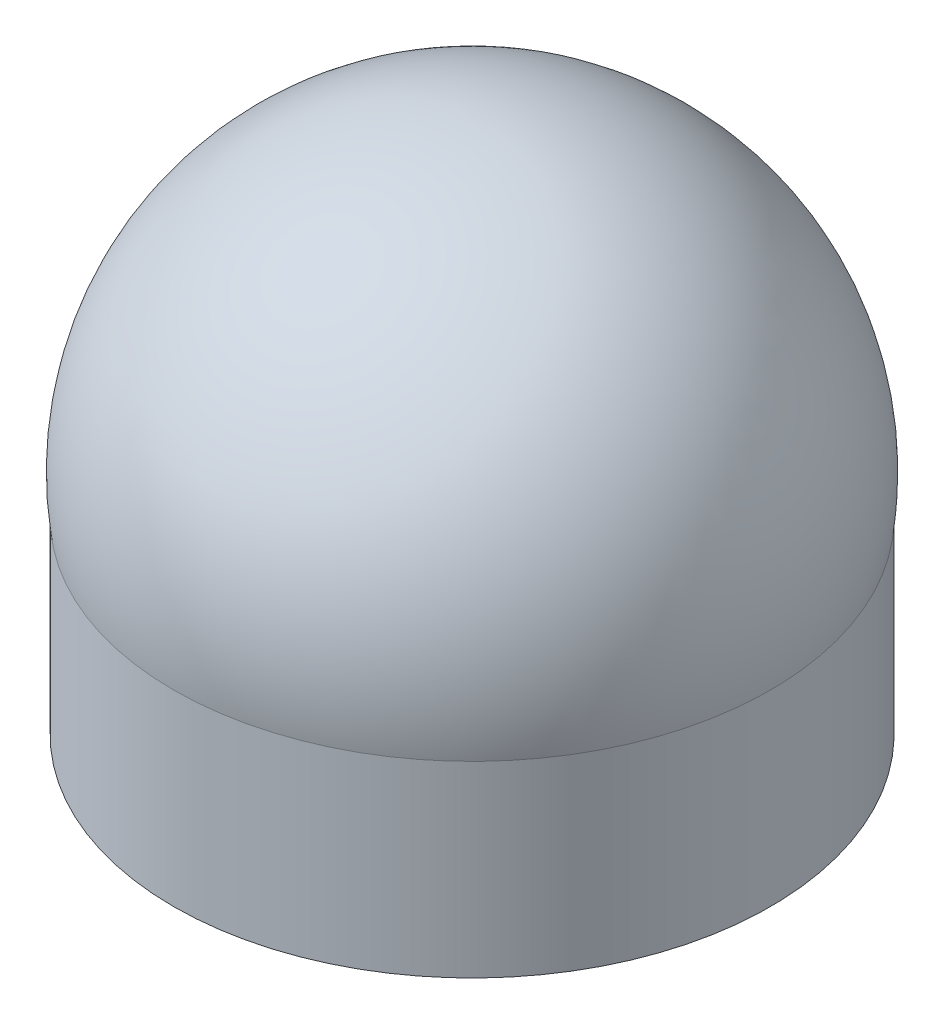
ISO-10303-21;
HEADER;
FILE_DESCRIPTION(('STEP AP214'),'2;1');
FILE_NAME('part.step','',(''),(''),'','','');
FILE_SCHEMA(('AUTOMOTIVE_DESIGN { 1 0 10303 214 1 1 1 1 }'));
ENDSEC;
DATA;
#1=APPLICATION_CONTEXT('core data for automotive mechanical design processes');
#2=APPLICATION_PROTOCOL_DEFINITION('international standard','automotive_design',2000,#1);
#3=PRODUCT_CONTEXT('',#1,'mechanical');
#4=PRODUCT('Part','Part','',(#3));
#5=PRODUCT_RELATED_PRODUCT_CATEGORY('part','',(#4));
#6=PRODUCT_DEFINITION_FORMATION('','',#4);
#7=PRODUCT_DEFINITION_CONTEXT('part definition',#1,'design');
#8=PRODUCT_DEFINITION('design','',#6,#7);
#9=PRODUCT_DEFINITION_SHAPE('','',#8);
#10=(LENGTH_UNIT() NAMED_UNIT(*) SI_UNIT(.MILLI.,.METRE.));
#11=(NAMED_UNIT(*) PLANE_ANGLE_UNIT() SI_UNIT($,.RADIAN.));
#12=(NAMED_UNIT(*) SI_UNIT($,.STERADIAN.) SOLID_ANGLE_UNIT());
#13=UNCERTAINTY_MEASURE_WITH_UNIT(LENGTH_MEASURE(1.E-05),#10,'distance_accuracy_value','');
#14=(GEOMETRIC_REPRESENTATION_CONTEXT(3) GLOBAL_UNCERTAINTY_ASSIGNED_CONTEXT((#13)) GLOBAL_UNIT_ASSIGNED_CONTEXT((#10,
#11,#12)) REPRESENTATION_CONTEXT('',''));
#15=CARTESIAN_POINT('',(0.,0.,0.));
#16=DIRECTION('',(0.,0.,1.));
#17=DIRECTION('',(1.,0.,0.));
#18=AXIS2_PLACEMENT_3D('',#15,#16,#17);
#19=CARTESIAN_POINT('',(0.,5.5,0.));
#20=DIRECTION('',(0.,-1.,0.));
#21=DIRECTION('',(0.,0.,-1.));
#22=AXIS2_PLACEMENT_3D('',#19,#20,#21);
#23=CYLINDRICAL_SURFACE('',#22,8.75);
#24=CARTESIAN_POINT('',(0.,5.5,0.));
#25=DIRECTION('',(0.,1.,0.));
#26=DIRECTION('',(0.,0.,1.));
#27=AXIS2_PLACEMENT_3D('',#24,#25,#26);
#28=CIRCLE('',#27,8.75);
#29=CARTESIAN_POINT('',(0.,5.5,8.75));
#30=VERTEX_POINT('',#29);
#31=EDGE_CURVE('E10',#30,#30,#28,.T.);
#32=ORIENTED_EDGE('',*,*,#31,.F.);
#33=EDGE_LOOP('',(#32));
#34=FACE_BOUND('',#33,.T.);
#35=CARTESIAN_POINT('',(0.,0.,0.));
#36=DIRECTION('',(0.,1.,0.));
#37=DIRECTION('',(0.,0.,1.));
#38=AXIS2_PLACEMENT_3D('',#35,#36,#37);
#39=CIRCLE('',#38,8.75);
#40=CARTESIAN_POINT('',(0.,0.,8.75));
#41=VERTEX_POINT('',#40);
#42=EDGE_CURVE('E40',#41,#41,#39,.T.);
#43=ORIENTED_EDGE('',*,*,#42,.T.);
#44=EDGE_LOOP('',(#43));
#45=FACE_BOUND('',#44,.T.);
#46=ADVANCED_FACE('F33',(#34,#45),#23,.T.);
#47=CARTESIAN_POINT('',(0.,6.671875,0.));
#48=DIRECTION('',(0.,0.,1.));
#49=DIRECTION('',(1.,0.,0.));
#50=AXIS2_PLACEMENT_3D('',#47,#48,#49);
#51=SPHERICAL_SURFACE('',#50,8.828125);
#52=CARTESIAN_POINT('',(0.,6.671875,0.));
#53=DIRECTION('',(0.,1.,0.));
#54=DIRECTION('',(0.,0.,1.));
#55=AXIS2_PLACEMENT_3D('',#52,#53,#54);
#56=SPHERICAL_SURFACE('',#55,8.828125);
#57=ORIENTED_EDGE('',*,*,#31,.T.);
#58=EDGE_LOOP('',(#57));
#59=FACE_BOUND('',#58,.T.);
#60=ADVANCED_FACE('F35',(#59),#56,.T.);
#61=CARTESIAN_POINT('',(0.,0.,0.));
#62=DIRECTION('',(0.,1.,0.));
#63=DIRECTION('',(0.,0.,1.));
#64=AXIS2_PLACEMENT_3D('',#61,#62,#63);
#65=PLANE('',#64);
#66=CARTESIAN_POINT('',(0.,0.,0.));
#67=DIRECTION('',(0.,1.,0.));
#68=DIRECTION('',(0.,0.,1.));
#69=AXIS2_PLACEMENT_3D('',#66,#67,#68);
#70=CIRCLE('',#69,6.75);
#71=CARTESIAN_POINT('',(0.,0.,6.75));
#72=VERTEX_POINT('',#71);
#73=EDGE_CURVE('E48',#72,#72,#70,.T.);
#74=ORIENTED_EDGE('',*,*,#73,.T.);
#75=EDGE_LOOP('',(#74));
#76=FACE_BOUND('',#75,.T.);
#77=ORIENTED_EDGE('',*,*,#42,.F.);
#78=EDGE_LOOP('',(#77));
#79=FACE_BOUND('',#78,.T.);
#80=ADVANCED_FACE('F54',(#76,#79),#65,.F.);
#81=CARTESIAN_POINT('',(0.,5.5,0.));
#82=DIRECTION('',(0.,-1.,0.));
#83=DIRECTION('',(0.,0.,-1.));
#84=AXIS2_PLACEMENT_3D('',#81,#82,#83);
#85=CYLINDRICAL_SURFACE('',#84,6.75);
#86=CARTESIAN_POINT('',(0.,5.64192790639519,0.));
#87=DIRECTION('',(0.,1.,0.));
#88=DIRECTION('',(0.,0.,1.));
#89=AXIS2_PLACEMENT_3D('',#86,#87,#88);
#90=CIRCLE('',#89,6.75);
#91=CARTESIAN_POINT('',(0.,5.64192790639519,6.75));
#92=VERTEX_POINT('',#91);
#93=EDGE_CURVE('E44',#92,#92,#90,.T.);
#94=ORIENTED_EDGE('',*,*,#93,.T.);
#95=EDGE_LOOP('',(#94));
#96=FACE_BOUND('',#95,.T.);
#97=ORIENTED_EDGE('',*,*,#73,.F.);
#98=EDGE_LOOP('',(#97));
#99=FACE_BOUND('',#98,.T.);
#100=ADVANCED_FACE('F57',(#96,#99),#85,.F.);
#101=CARTESIAN_POINT('',(0.,6.671875,0.));
#102=DIRECTION('',(0.,0.,1.));
#103=DIRECTION('',(1.,0.,0.));
#104=AXIS2_PLACEMENT_3D('',#101,#102,#103);
#105=SPHERICAL_SURFACE('',#104,6.828125);
#106=CARTESIAN_POINT('',(0.,6.671875,0.));
#107=DIRECTION('',(0.,1.,0.));
#108=DIRECTION('',(0.,0.,1.));
#109=AXIS2_PLACEMENT_3D('',#106,#107,#108);
#110=SPHERICAL_SURFACE('',#109,6.828125);
#111=ORIENTED_EDGE('',*,*,#93,.F.);
#112=EDGE_LOOP('',(#111));
#113=FACE_BOUND('',#112,.T.);
#114=ADVANCED_FACE('F59',(#113),#110,.F.);
#115=CLOSED_SHELL('',(#46,#60,#80,#100,#114));
#116=MANIFOLD_SOLID_BREP('B2',#115);
#117=ADVANCED_BREP_SHAPE_REPRESENTATION('',(#18,#116),#14);
#118=SHAPE_DEFINITION_REPRESENTATION(#9,#117);
ENDSEC;
END-ISO-10303-21;
